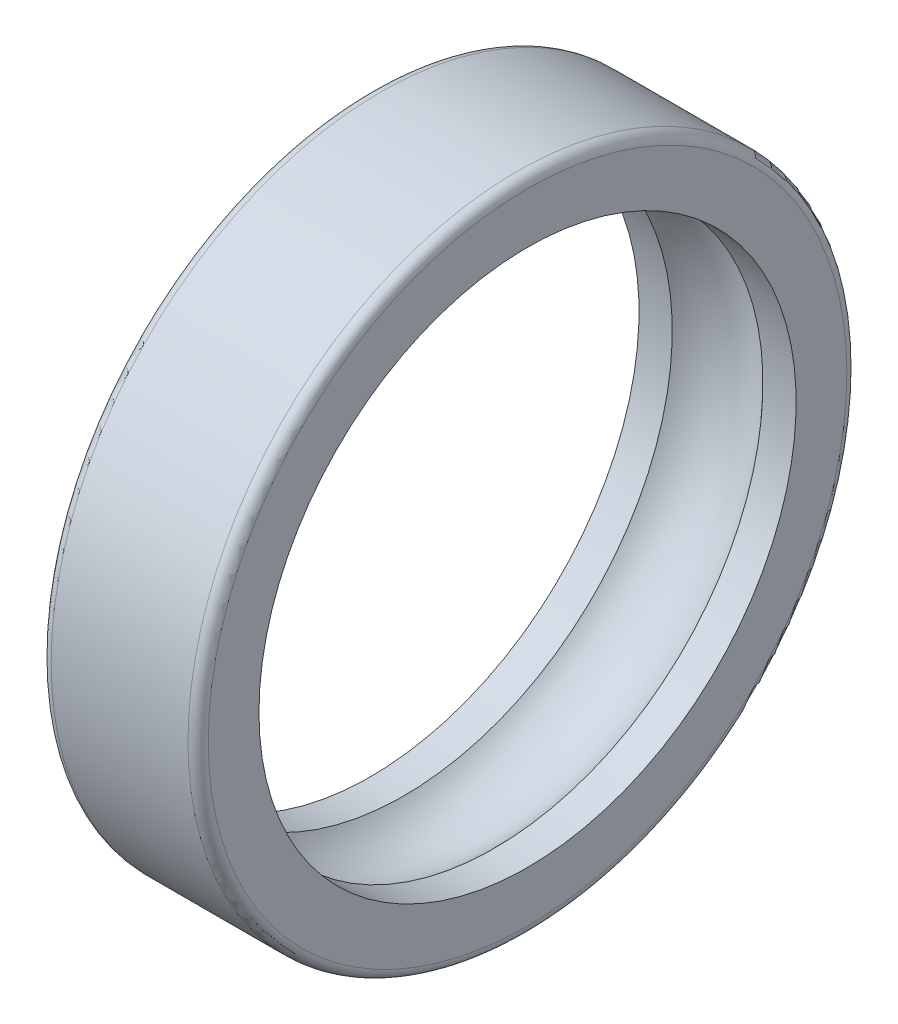
ISO-10303-21;
HEADER;
FILE_DESCRIPTION(('STEP AP214'),'2;1');
FILE_NAME('part.step','',(''),(''),'','','');
FILE_SCHEMA(('AUTOMOTIVE_DESIGN { 1 0 10303 214 1 1 1 1 }'));
ENDSEC;
DATA;
#1=APPLICATION_CONTEXT('core data for automotive mechanical design processes');
#2=APPLICATION_PROTOCOL_DEFINITION('international standard','automotive_design',2000,#1);
#3=PRODUCT_CONTEXT('',#1,'mechanical');
#4=PRODUCT('Part','Part','',(#3));
#5=PRODUCT_RELATED_PRODUCT_CATEGORY('part','',(#4));
#6=PRODUCT_DEFINITION_FORMATION('','',#4);
#7=PRODUCT_DEFINITION_CONTEXT('part definition',#1,'design');
#8=PRODUCT_DEFINITION('design','',#6,#7);
#9=PRODUCT_DEFINITION_SHAPE('','',#8);
#10=(LENGTH_UNIT() NAMED_UNIT(*) SI_UNIT(.MILLI.,.METRE.));
#11=(NAMED_UNIT(*) PLANE_ANGLE_UNIT() SI_UNIT($,.RADIAN.));
#12=(NAMED_UNIT(*) SI_UNIT($,.STERADIAN.) SOLID_ANGLE_UNIT());
#13=UNCERTAINTY_MEASURE_WITH_UNIT(LENGTH_MEASURE(1.E-05),#10,'distance_accuracy_value','');
#14=(GEOMETRIC_REPRESENTATION_CONTEXT(3) GLOBAL_UNCERTAINTY_ASSIGNED_CONTEXT((#13)) GLOBAL_UNIT_ASSIGNED_CONTEXT((#10,
#11,#12)) REPRESENTATION_CONTEXT('',''));
#15=CARTESIAN_POINT('',(0.,0.,0.));
#16=DIRECTION('',(0.,0.,1.));
#17=DIRECTION('',(1.,0.,0.));
#18=AXIS2_PLACEMENT_3D('',#15,#16,#17);
#19=CARTESIAN_POINT('',(-11.1109615985399,65.,0.));
#20=DIRECTION('',(1.,0.,0.));
#21=DIRECTION('',(0.,0.,-1.));
#22=AXIS2_PLACEMENT_3D('',#19,#20,#21);
#23=PLANE('',#22);
#24=CARTESIAN_POINT('',(-11.1109615985399,0.,0.));
#25=DIRECTION('',(1.,0.,0.));
#26=DIRECTION('',(0.,0.,-1.));
#27=AXIS2_PLACEMENT_3D('',#24,#25,#26);
#28=CIRCLE('',#27,63.);
#29=CARTESIAN_POINT('',(-11.1109615985399,0.,-63.));
#30=VERTEX_POINT('',#29);
#31=EDGE_CURVE('E10',#30,#30,#28,.F.);
#32=ORIENTED_EDGE('',*,*,#31,.T.);
#33=EDGE_LOOP('',(#32));
#34=FACE_BOUND('',#33,.T.);
#35=CARTESIAN_POINT('',(-11.1109615985399,0.,0.));
#36=DIRECTION('',(-1.,0.,0.));
#37=DIRECTION('',(0.,0.,1.));
#38=AXIS2_PLACEMENT_3D('',#35,#36,#37);
#39=CIRCLE('',#38,53.);
#40=CARTESIAN_POINT('',(-11.1109615985399,0.,53.));
#41=VERTEX_POINT('',#40);
#42=EDGE_CURVE('E51',#41,#41,#39,.T.);
#43=ORIENTED_EDGE('',*,*,#42,.F.);
#44=EDGE_LOOP('',(#43));
#45=FACE_BOUND('',#44,.T.);
#46=ADVANCED_FACE('F31',(#34,#45),#23,.F.);
#47=CARTESIAN_POINT('',(0.,0.,0.));
#48=DIRECTION('',(-1.,0.,0.));
#49=DIRECTION('',(0.,0.,1.));
#50=AXIS2_PLACEMENT_3D('',#47,#48,#49);
#51=CYLINDRICAL_SURFACE('',#50,53.);
#52=CARTESIAN_POINT('',(-4.55523350853906,0.,0.));
#53=DIRECTION('',(-1.,0.,0.));
#54=DIRECTION('',(0.,0.,1.));
#55=AXIS2_PLACEMENT_3D('',#52,#53,#54);
#56=CIRCLE('',#55,53.);
#57=CARTESIAN_POINT('',(-4.55523350853906,0.,53.));
#58=VERTEX_POINT('',#57);
#59=EDGE_CURVE('E54',#58,#58,#56,.T.);
#60=ORIENTED_EDGE('',*,*,#59,.F.);
#61=EDGE_LOOP('',(#60));
#62=FACE_BOUND('',#61,.T.);
#63=ORIENTED_EDGE('',*,*,#42,.T.);
#64=EDGE_LOOP('',(#63));
#65=FACE_BOUND('',#64,.T.);
#66=ADVANCED_FACE('F75',(#62,#65),#51,.F.);
#67=CARTESIAN_POINT('',(4.3890384014601,0.,0.));
#68=DIRECTION('',(-1.,0.,0.));
#69=DIRECTION('',(0.,0.,1.));
#70=AXIS2_PLACEMENT_3D('',#67,#68,#69);
#71=TOROIDAL_SURFACE('',#70,45.,12.);
#72=CARTESIAN_POINT('',(13.3333103114593,0.,0.));
#73=DIRECTION('',(-1.,0.,0.));
#74=DIRECTION('',(0.,0.,1.));
#75=AXIS2_PLACEMENT_3D('',#72,#73,#74);
#76=CIRCLE('',#75,53.);
#77=CARTESIAN_POINT('',(13.3333103114593,0.,53.));
#78=VERTEX_POINT('',#77);
#79=EDGE_CURVE('E57',#78,#78,#76,.T.);
#80=ORIENTED_EDGE('',*,*,#79,.F.);
#81=EDGE_LOOP('',(#80));
#82=FACE_BOUND('',#81,.T.);
#83=ORIENTED_EDGE('',*,*,#59,.T.);
#84=EDGE_LOOP('',(#83));
#85=FACE_BOUND('',#84,.T.);
#86=ADVANCED_FACE('F69',(#82,#85),#71,.F.);
#87=CARTESIAN_POINT('',(0.,0.,0.));
#88=DIRECTION('',(-1.,0.,0.));
#89=DIRECTION('',(0.,0.,1.));
#90=AXIS2_PLACEMENT_3D('',#87,#88,#89);
#91=CYLINDRICAL_SURFACE('',#90,53.);
#92=CARTESIAN_POINT('',(19.8890384014601,0.,0.));
#93=DIRECTION('',(-1.,0.,0.));
#94=DIRECTION('',(0.,0.,1.));
#95=AXIS2_PLACEMENT_3D('',#92,#93,#94);
#96=CIRCLE('',#95,53.);
#97=CARTESIAN_POINT('',(19.8890384014601,0.,53.));
#98=VERTEX_POINT('',#97);
#99=EDGE_CURVE('E60',#98,#98,#96,.T.);
#100=ORIENTED_EDGE('',*,*,#99,.F.);
#101=EDGE_LOOP('',(#100));
#102=FACE_BOUND('',#101,.T.);
#103=ORIENTED_EDGE('',*,*,#79,.T.);
#104=EDGE_LOOP('',(#103));
#105=FACE_BOUND('',#104,.T.);
#106=ADVANCED_FACE('F66',(#102,#105),#91,.F.);
#107=CARTESIAN_POINT('',(19.8890384014601,65.,0.));
#108=DIRECTION('',(-1.,0.,0.));
#109=DIRECTION('',(0.,0.,1.));
#110=AXIS2_PLACEMENT_3D('',#107,#108,#109);
#111=PLANE('',#110);
#112=CARTESIAN_POINT('',(19.8890384014601,0.,0.));
#113=DIRECTION('',(-1.,0.,0.));
#114=DIRECTION('',(0.,0.,1.));
#115=AXIS2_PLACEMENT_3D('',#112,#113,#114);
#116=CIRCLE('',#115,63.);
#117=CARTESIAN_POINT('',(19.8890384014601,0.,63.));
#118=VERTEX_POINT('',#117);
#119=EDGE_CURVE('E38',#118,#118,#116,.F.);
#120=ORIENTED_EDGE('',*,*,#119,.T.);
#121=EDGE_LOOP('',(#120));
#122=FACE_BOUND('',#121,.T.);
#123=ORIENTED_EDGE('',*,*,#99,.T.);
#124=EDGE_LOOP('',(#123));
#125=FACE_BOUND('',#124,.T.);
#126=ADVANCED_FACE('F64',(#122,#125),#111,.F.);
#127=CARTESIAN_POINT('',(0.,0.,0.));
#128=DIRECTION('',(-1.,0.,0.));
#129=DIRECTION('',(0.,0.,1.));
#130=AXIS2_PLACEMENT_3D('',#127,#128,#129);
#131=CYLINDRICAL_SURFACE('',#130,65.);
#132=CARTESIAN_POINT('',(17.8890384014601,0.,0.));
#133=DIRECTION('',(-1.,0.,0.));
#134=DIRECTION('',(0.,0.,1.));
#135=AXIS2_PLACEMENT_3D('',#132,#133,#134);
#136=CIRCLE('',#135,65.);
#137=CARTESIAN_POINT('',(17.8890384014601,0.,65.));
#138=VERTEX_POINT('',#137);
#139=EDGE_CURVE('E42',#138,#138,#136,.T.);
#140=ORIENTED_EDGE('',*,*,#139,.T.);
#141=EDGE_LOOP('',(#140));
#142=FACE_BOUND('',#141,.T.);
#143=CARTESIAN_POINT('',(-9.1109615985399,0.,0.));
#144=DIRECTION('',(1.,0.,0.));
#145=DIRECTION('',(0.,0.,-1.));
#146=AXIS2_PLACEMENT_3D('',#143,#144,#145);
#147=CIRCLE('',#146,65.);
#148=CARTESIAN_POINT('',(-9.1109615985399,0.,-65.));
#149=VERTEX_POINT('',#148);
#150=EDGE_CURVE('E46',#149,#149,#147,.T.);
#151=ORIENTED_EDGE('',*,*,#150,.T.);
#152=EDGE_LOOP('',(#151));
#153=FACE_BOUND('',#152,.T.);
#154=ADVANCED_FACE('F90',(#142,#153),#131,.T.);
#155=CARTESIAN_POINT('',(17.8890384014601,0.,0.));
#156=DIRECTION('',(-1.,0.,0.));
#157=DIRECTION('',(0.,0.,1.));
#158=AXIS2_PLACEMENT_3D('',#155,#156,#157);
#159=TOROIDAL_SURFACE('',#158,63.,2.);
#160=ORIENTED_EDGE('',*,*,#119,.F.);
#161=EDGE_LOOP('',(#160));
#162=FACE_BOUND('',#161,.T.);
#163=ORIENTED_EDGE('',*,*,#139,.F.);
#164=EDGE_LOOP('',(#163));
#165=FACE_BOUND('',#164,.T.);
#166=ADVANCED_FACE('F88',(#162,#165),#159,.T.);
#167=CARTESIAN_POINT('',(-9.1109615985399,0.,0.));
#168=DIRECTION('',(1.,0.,0.));
#169=DIRECTION('',(0.,0.,-1.));
#170=AXIS2_PLACEMENT_3D('',#167,#168,#169);
#171=TOROIDAL_SURFACE('',#170,63.,2.);
#172=ORIENTED_EDGE('',*,*,#150,.F.);
#173=EDGE_LOOP('',(#172));
#174=FACE_BOUND('',#173,.T.);
#175=ORIENTED_EDGE('',*,*,#31,.F.);
#176=EDGE_LOOP('',(#175));
#177=FACE_BOUND('',#176,.T.);
#178=ADVANCED_FACE('F33',(#174,#177),#171,.T.);
#179=CLOSED_SHELL('',(#46,#66,#86,#106,#126,#154,#166,#178));
#180=MANIFOLD_SOLID_BREP('B2',#179);
#181=ADVANCED_BREP_SHAPE_REPRESENTATION('',(#18,#180),#14);
#182=SHAPE_DEFINITION_REPRESENTATION(#9,#181);
ENDSEC;
END-ISO-10303-21;
